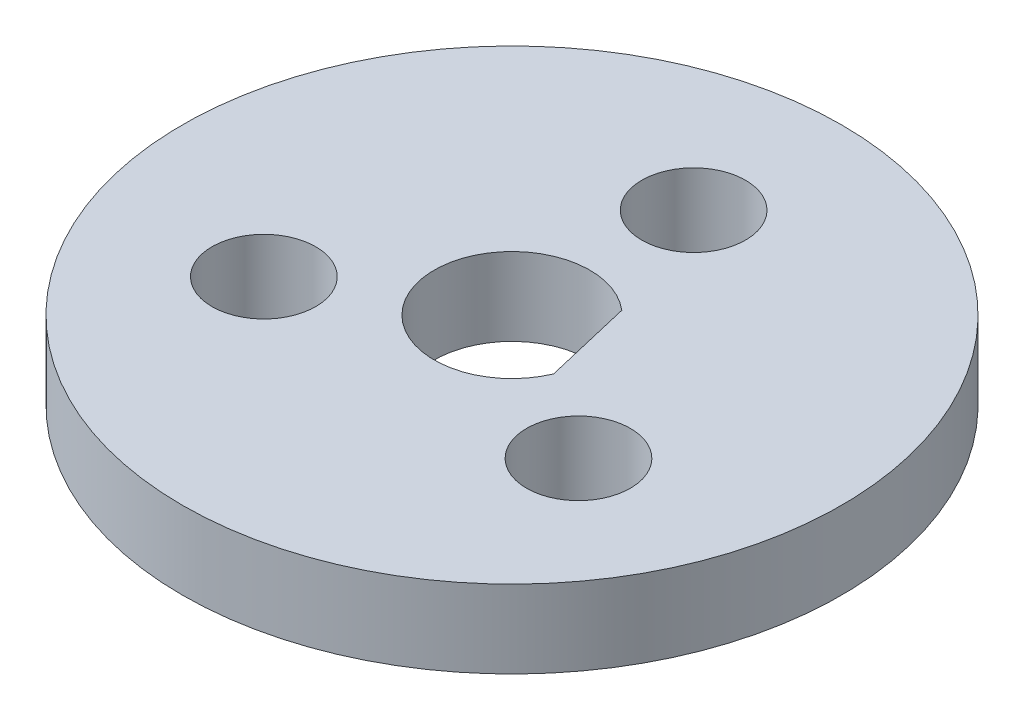
ISO-10303-21;
HEADER;
FILE_DESCRIPTION(('STEP AP214'),'2;1');
FILE_NAME('part.step','',(''),(''),'','','');
FILE_SCHEMA(('AUTOMOTIVE_DESIGN { 1 0 10303 214 1 1 1 1 }'));
ENDSEC;
DATA;
#1=APPLICATION_CONTEXT('core data for automotive mechanical design processes');
#2=APPLICATION_PROTOCOL_DEFINITION('international standard','automotive_design',2000,#1);
#3=PRODUCT_CONTEXT('',#1,'mechanical');
#4=PRODUCT('Part','Part','',(#3));
#5=PRODUCT_RELATED_PRODUCT_CATEGORY('part','',(#4));
#6=PRODUCT_DEFINITION_FORMATION('','',#4);
#7=PRODUCT_DEFINITION_CONTEXT('part definition',#1,'design');
#8=PRODUCT_DEFINITION('design','',#6,#7);
#9=PRODUCT_DEFINITION_SHAPE('','',#8);
#10=(LENGTH_UNIT() NAMED_UNIT(*) SI_UNIT(.MILLI.,.METRE.));
#11=(NAMED_UNIT(*) PLANE_ANGLE_UNIT() SI_UNIT($,.RADIAN.));
#12=(NAMED_UNIT(*) SI_UNIT($,.STERADIAN.) SOLID_ANGLE_UNIT());
#13=UNCERTAINTY_MEASURE_WITH_UNIT(LENGTH_MEASURE(1.E-05),#10,'distance_accuracy_value','');
#14=(GEOMETRIC_REPRESENTATION_CONTEXT(3) GLOBAL_UNCERTAINTY_ASSIGNED_CONTEXT((#13)) GLOBAL_UNIT_ASSIGNED_CONTEXT((#10,
#11,#12)) REPRESENTATION_CONTEXT('',''));
#15=CARTESIAN_POINT('',(0.,0.,0.));
#16=DIRECTION('',(0.,0.,1.));
#17=DIRECTION('',(1.,0.,0.));
#18=AXIS2_PLACEMENT_3D('',#15,#16,#17);
#19=CARTESIAN_POINT('',(0.,3.,0.));
#20=DIRECTION('',(0.,1.,0.));
#21=DIRECTION('',(0.,0.,1.));
#22=AXIS2_PLACEMENT_3D('',#19,#20,#21);
#23=PLANE('',#22);
#24=CARTESIAN_POINT('',(0.,3.,-7.));
#25=DIRECTION('',(0.,1.,0.));
#26=DIRECTION('',(0.,0.,1.));
#27=AXIS2_PLACEMENT_3D('',#24,#25,#26);
#28=CIRCLE('',#27,2.00000000000065);
#29=CARTESIAN_POINT('',(0.,3.,-4.99999999999935));
#30=VERTEX_POINT('',#29);
#31=EDGE_CURVE('E90',#30,#30,#28,.T.);
#32=ORIENTED_EDGE('',*,*,#31,.F.);
#33=EDGE_LOOP('',(#32));
#34=FACE_BOUND('',#33,.T.);
#35=CARTESIAN_POINT('',(-6.06217782649056,3.,3.5000000000003));
#36=DIRECTION('',(0.,1.,0.));
#37=DIRECTION('',(0.,0.,1.));
#38=AXIS2_PLACEMENT_3D('',#35,#36,#37);
#39=CIRCLE('',#38,2.00000000000065);
#40=CARTESIAN_POINT('',(-6.06217782649056,3.,5.50000000000094));
#41=VERTEX_POINT('',#40);
#42=EDGE_CURVE('E180',#41,#41,#39,.T.);
#43=ORIENTED_EDGE('',*,*,#42,.F.);
#44=EDGE_LOOP('',(#43));
#45=FACE_BOUND('',#44,.T.);
#46=CARTESIAN_POINT('',(6.06217782649158,3.,3.4999999999997));
#47=DIRECTION('',(0.,1.,0.));
#48=DIRECTION('',(0.,0.,1.));
#49=AXIS2_PLACEMENT_3D('',#46,#47,#48);
#50=CIRCLE('',#49,2.00000000000065);
#51=CARTESIAN_POINT('',(6.06217782649158,3.,5.50000000000035));
#52=VERTEX_POINT('',#51);
#53=EDGE_CURVE('E78',#52,#52,#50,.T.);
#54=ORIENTED_EDGE('',*,*,#53,.F.);
#55=EDGE_LOOP('',(#54));
#56=FACE_BOUND('',#55,.T.);
#57=CARTESIAN_POINT('',(0.,3.,0.));
#58=DIRECTION('',(0.,1.,0.));
#59=DIRECTION('',(0.,0.,1.));
#60=AXIS2_PLACEMENT_3D('',#57,#58,#59);
#61=CIRCLE('',#60,12.7);
#62=CARTESIAN_POINT('',(0.,3.,12.7));
#63=VERTEX_POINT('',#62);
#64=EDGE_CURVE('E82',#63,#63,#61,.T.);
#65=ORIENTED_EDGE('',*,*,#64,.T.);
#66=EDGE_LOOP('',(#65));
#67=FACE_BOUND('',#66,.T.);
#68=CARTESIAN_POINT('',(0.,3.,0.));
#69=DIRECTION('',(0.,1.,0.));
#70=DIRECTION('',(0.,0.,1.));
#71=AXIS2_PLACEMENT_3D('',#68,#69,#70);
#72=CIRCLE('',#71,3.);
#73=CARTESIAN_POINT('',(1.95650476368316,3.,-2.27422274847586));
#74=VERTEX_POINT('',#73);
#75=CARTESIAN_POINT('',(2.7659356849304,3.,1.16172276676865));
#76=VERTEX_POINT('',#75);
#77=EDGE_CURVE('E70',#74,#76,#72,.T.);
#78=ORIENTED_EDGE('',*,*,#77,.F.);
#79=DIRECTION('',(0.229300544262673,0.,0.973355670040937));
#80=VECTOR('',#79,1.);
#81=CARTESIAN_POINT('',(2.36122022430678,3.,-0.556249990853605));
#82=LINE('',#81,#80);
#83=EDGE_CURVE('E52',#74,#76,#82,.T.);
#84=ORIENTED_EDGE('',*,*,#83,.T.);
#85=EDGE_LOOP('',(#78,#84));
#86=FACE_BOUND('',#85,.T.);
#87=ADVANCED_FACE('F35',(#34,#45,#56,#67,#86),#23,.T.);
#88=CARTESIAN_POINT('',(0.,0.,0.));
#89=DIRECTION('',(0.,1.,0.));
#90=DIRECTION('',(0.,0.,1.));
#91=AXIS2_PLACEMENT_3D('',#88,#89,#90);
#92=PLANE('',#91);
#93=CARTESIAN_POINT('',(0.,0.,-7.));
#94=DIRECTION('',(0.,1.,0.));
#95=DIRECTION('',(0.,0.,1.));
#96=AXIS2_PLACEMENT_3D('',#93,#94,#95);
#97=CIRCLE('',#96,2.00000000000065);
#98=CARTESIAN_POINT('',(0.,0.,-4.99999999999935));
#99=VERTEX_POINT('',#98);
#100=EDGE_CURVE('E39',#99,#99,#97,.T.);
#101=ORIENTED_EDGE('',*,*,#100,.T.);
#102=EDGE_LOOP('',(#101));
#103=FACE_BOUND('',#102,.T.);
#104=CARTESIAN_POINT('',(-6.06217782649056,0.,3.5000000000003));
#105=DIRECTION('',(0.,1.,0.));
#106=DIRECTION('',(0.,0.,1.));
#107=AXIS2_PLACEMENT_3D('',#104,#105,#106);
#108=CIRCLE('',#107,2.00000000000065);
#109=CARTESIAN_POINT('',(-6.06217782649056,0.,5.50000000000094));
#110=VERTEX_POINT('',#109);
#111=EDGE_CURVE('E76',#110,#110,#108,.T.);
#112=ORIENTED_EDGE('',*,*,#111,.T.);
#113=EDGE_LOOP('',(#112));
#114=FACE_BOUND('',#113,.T.);
#115=CARTESIAN_POINT('',(6.06217782649158,0.,3.4999999999997));
#116=DIRECTION('',(0.,1.,0.));
#117=DIRECTION('',(0.,0.,1.));
#118=AXIS2_PLACEMENT_3D('',#115,#116,#117);
#119=CIRCLE('',#118,2.00000000000065);
#120=CARTESIAN_POINT('',(6.06217782649158,0.,5.50000000000035));
#121=VERTEX_POINT('',#120);
#122=EDGE_CURVE('E88',#121,#121,#119,.T.);
#123=ORIENTED_EDGE('',*,*,#122,.T.);
#124=EDGE_LOOP('',(#123));
#125=FACE_BOUND('',#124,.T.);
#126=CARTESIAN_POINT('',(0.,0.,0.));
#127=DIRECTION('',(0.,1.,0.));
#128=DIRECTION('',(0.,0.,1.));
#129=AXIS2_PLACEMENT_3D('',#126,#127,#128);
#130=CIRCLE('',#129,12.7);
#131=CARTESIAN_POINT('',(0.,0.,12.7));
#132=VERTEX_POINT('',#131);
#133=EDGE_CURVE('E66',#132,#132,#130,.T.);
#134=ORIENTED_EDGE('',*,*,#133,.F.);
#135=EDGE_LOOP('',(#134));
#136=FACE_BOUND('',#135,.T.);
#137=DIRECTION('',(0.229300544262673,0.,0.973355670040937));
#138=VECTOR('',#137,1.);
#139=CARTESIAN_POINT('',(2.36122022430678,0.,-0.556249990853605));
#140=LINE('',#139,#138);
#141=CARTESIAN_POINT('',(1.95650476368316,0.,-2.27422274847586));
#142=VERTEX_POINT('',#141);
#143=CARTESIAN_POINT('',(2.7659356849304,0.,1.16172276676865));
#144=VERTEX_POINT('',#143);
#145=EDGE_CURVE('E11',#142,#144,#140,.T.);
#146=ORIENTED_EDGE('',*,*,#145,.F.);
#147=CARTESIAN_POINT('',(0.,0.,0.));
#148=DIRECTION('',(0.,1.,0.));
#149=DIRECTION('',(0.,0.,1.));
#150=AXIS2_PLACEMENT_3D('',#147,#148,#149);
#151=CIRCLE('',#150,3.);
#152=EDGE_CURVE('E44',#142,#144,#151,.T.);
#153=ORIENTED_EDGE('',*,*,#152,.T.);
#154=EDGE_LOOP('',(#146,#153));
#155=FACE_BOUND('',#154,.T.);
#156=ADVANCED_FACE('F94',(#103,#114,#125,#136,#155),#92,.F.);
#157=CARTESIAN_POINT('',(0.,3.,0.));
#158=DIRECTION('',(0.,-1.,0.));
#159=DIRECTION('',(0.,0.,-1.));
#160=AXIS2_PLACEMENT_3D('',#157,#158,#159);
#161=CYLINDRICAL_SURFACE('',#160,12.7);
#162=ORIENTED_EDGE('',*,*,#64,.F.);
#163=EDGE_LOOP('',(#162));
#164=FACE_BOUND('',#163,.T.);
#165=ORIENTED_EDGE('',*,*,#133,.T.);
#166=EDGE_LOOP('',(#165));
#167=FACE_BOUND('',#166,.T.);
#168=ADVANCED_FACE('F37',(#164,#167),#161,.T.);
#169=CARTESIAN_POINT('',(2.36122022430678,-7.,-0.556249990853605));
#170=DIRECTION('',(-0.973355670040937,0.,0.229300544262673));
#171=DIRECTION('',(0.229300544262673,0.,0.973355670040937));
#172=AXIS2_PLACEMENT_3D('',#169,#170,#171);
#173=PLANE('',#172);
#174=ORIENTED_EDGE('',*,*,#145,.T.);
#175=DIRECTION('',(0.,1.,0.));
#176=VECTOR('',#175,1.);
#177=CARTESIAN_POINT('',(2.7659356849304,-7.,1.16172276676865));
#178=LINE('',#177,#176);
#179=EDGE_CURVE('E59',#144,#76,#178,.T.);
#180=ORIENTED_EDGE('',*,*,#179,.T.);
#181=ORIENTED_EDGE('',*,*,#83,.F.);
#182=DIRECTION('',(0.,1.,0.));
#183=VECTOR('',#182,1.);
#184=CARTESIAN_POINT('',(1.95650476368316,-7.,-2.27422274847586));
#185=LINE('',#184,#183);
#186=EDGE_CURVE('E67',#142,#74,#185,.T.);
#187=ORIENTED_EDGE('',*,*,#186,.F.);
#188=EDGE_LOOP('',(#174,#180,#181,#187));
#189=FACE_BOUND('',#188,.T.);
#190=ADVANCED_FACE('F63',(#189),#173,.T.);
#191=CARTESIAN_POINT('',(0.,-7.,0.));
#192=DIRECTION('',(0.,1.,0.));
#193=DIRECTION('',(0.,0.,1.));
#194=AXIS2_PLACEMENT_3D('',#191,#192,#193);
#195=CYLINDRICAL_SURFACE('',#194,3.);
#196=ORIENTED_EDGE('',*,*,#186,.T.);
#197=ORIENTED_EDGE('',*,*,#77,.T.);
#198=ORIENTED_EDGE('',*,*,#179,.F.);
#199=ORIENTED_EDGE('',*,*,#152,.F.);
#200=EDGE_LOOP('',(#196,#197,#198,#199));
#201=FACE_BOUND('',#200,.T.);
#202=ADVANCED_FACE('F71',(#201),#195,.F.);
#203=CARTESIAN_POINT('',(6.06217782649158,-2.,3.4999999999997));
#204=DIRECTION('',(0.,1.,0.));
#205=DIRECTION('',(0.,0.,1.));
#206=AXIS2_PLACEMENT_3D('',#203,#204,#205);
#207=CYLINDRICAL_SURFACE('',#206,2.00000000000065);
#208=ORIENTED_EDGE('',*,*,#53,.T.);
#209=EDGE_LOOP('',(#208));
#210=FACE_BOUND('',#209,.T.);
#211=ORIENTED_EDGE('',*,*,#122,.F.);
#212=EDGE_LOOP('',(#211));
#213=FACE_BOUND('',#212,.T.);
#214=ADVANCED_FACE('F100',(#210,#213),#207,.F.);
#215=CARTESIAN_POINT('',(-6.06217782649056,-2.,3.5000000000003));
#216=DIRECTION('',(0.,1.,0.));
#217=DIRECTION('',(0.,0.,1.));
#218=AXIS2_PLACEMENT_3D('',#215,#216,#217);
#219=CYLINDRICAL_SURFACE('',#218,2.00000000000065);
#220=ORIENTED_EDGE('',*,*,#42,.T.);
#221=EDGE_LOOP('',(#220));
#222=FACE_BOUND('',#221,.T.);
#223=ORIENTED_EDGE('',*,*,#111,.F.);
#224=EDGE_LOOP('',(#223));
#225=FACE_BOUND('',#224,.T.);
#226=ADVANCED_FACE('F97',(#222,#225),#219,.F.);
#227=CARTESIAN_POINT('',(0.,-2.,-7.));
#228=DIRECTION('',(0.,1.,0.));
#229=DIRECTION('',(0.,0.,1.));
#230=AXIS2_PLACEMENT_3D('',#227,#228,#229);
#231=CYLINDRICAL_SURFACE('',#230,2.00000000000065);
#232=ORIENTED_EDGE('',*,*,#31,.T.);
#233=EDGE_LOOP('',(#232));
#234=FACE_BOUND('',#233,.T.);
#235=ORIENTED_EDGE('',*,*,#100,.F.);
#236=EDGE_LOOP('',(#235));
#237=FACE_BOUND('',#236,.T.);
#238=ADVANCED_FACE('F99',(#234,#237),#231,.F.);
#239=CLOSED_SHELL('',(#87,#156,#168,#190,#202,#214,#226,#238));
#240=MANIFOLD_SOLID_BREP('B2',#239);
#241=ADVANCED_BREP_SHAPE_REPRESENTATION('',(#18,#240),#14);
#242=SHAPE_DEFINITION_REPRESENTATION(#9,#241);
ENDSEC;
END-ISO-10303-21;
